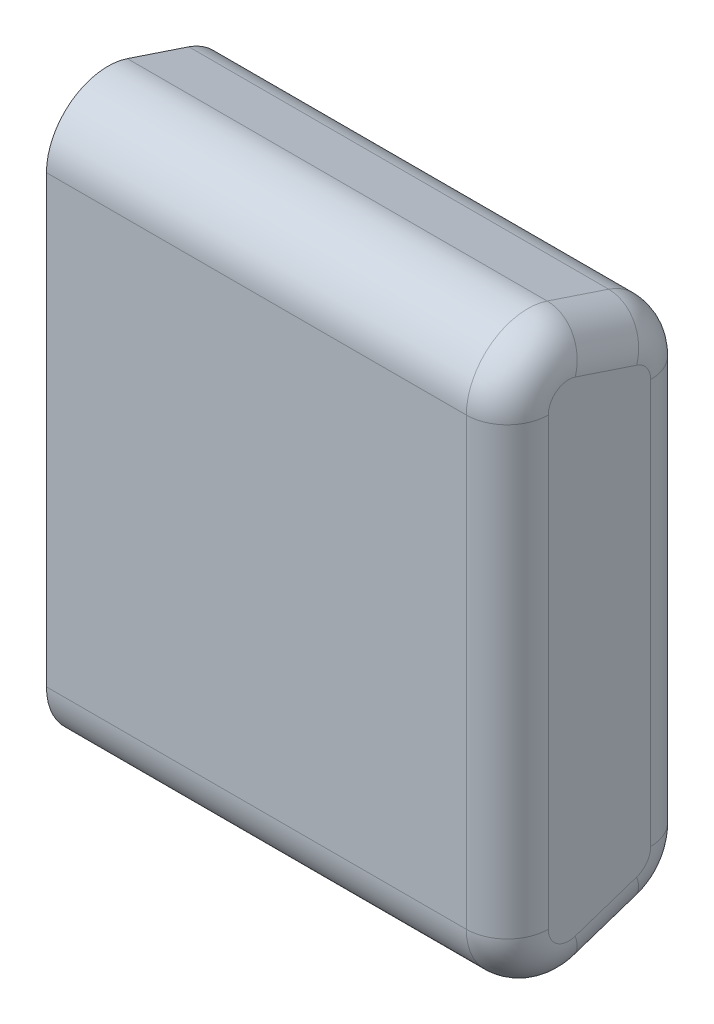
ISO-10303-21;
HEADER;
FILE_DESCRIPTION(('STEP AP214'),'2;1');
FILE_NAME('part.step','',(''),(''),'','','');
FILE_SCHEMA(('AUTOMOTIVE_DESIGN { 1 0 10303 214 1 1 1 1 }'));
ENDSEC;
DATA;
#1=APPLICATION_CONTEXT('core data for automotive mechanical design processes');
#2=APPLICATION_PROTOCOL_DEFINITION('international standard','automotive_design',2000,#1);
#3=PRODUCT_CONTEXT('',#1,'mechanical');
#4=PRODUCT('Part','Part','',(#3));
#5=PRODUCT_RELATED_PRODUCT_CATEGORY('part','',(#4));
#6=PRODUCT_DEFINITION_FORMATION('','',#4);
#7=PRODUCT_DEFINITION_CONTEXT('part definition',#1,'design');
#8=PRODUCT_DEFINITION('design','',#6,#7);
#9=PRODUCT_DEFINITION_SHAPE('','',#8);
#10=(LENGTH_UNIT() NAMED_UNIT(*) SI_UNIT(.MILLI.,.METRE.));
#11=(NAMED_UNIT(*) PLANE_ANGLE_UNIT() SI_UNIT($,.RADIAN.));
#12=(NAMED_UNIT(*) SI_UNIT($,.STERADIAN.) SOLID_ANGLE_UNIT());
#13=UNCERTAINTY_MEASURE_WITH_UNIT(LENGTH_MEASURE(1.E-05),#10,'distance_accuracy_value','');
#14=(GEOMETRIC_REPRESENTATION_CONTEXT(3) GLOBAL_UNCERTAINTY_ASSIGNED_CONTEXT((#13)) GLOBAL_UNIT_ASSIGNED_CONTEXT((#10,
#11,#12)) REPRESENTATION_CONTEXT('',''));
#15=CARTESIAN_POINT('',(0.,0.,0.));
#16=DIRECTION('',(0.,0.,1.));
#17=DIRECTION('',(1.,0.,0.));
#18=AXIS2_PLACEMENT_3D('',#15,#16,#17);
#19=CARTESIAN_POINT('',(-20.7640151736378,2.70446142471295,1.50594305849579));
#20=DIRECTION('',(0.,0.316227766016839,0.948683298050514));
#21=DIRECTION('',(0.,-0.948683298050514,0.316227766016839));
#22=AXIS2_PLACEMENT_3D('',#19,#20,#21);
#23=CYLINDRICAL_SURFACE('',#22,0.500000000000001);
#24=CARTESIAN_POINT('',(-20.7640151736378,2.95446142471295,2.25594305849579));
#25=DIRECTION('',(0.,0.316227766016837,0.948683298050514));
#26=DIRECTION('',(0.,-0.948683298050514,0.316227766016837));
#27=AXIS2_PLACEMENT_3D('',#24,#25,#26);
#28=CIRCLE('',#27,0.500000000000001);
#29=CARTESIAN_POINT('',(-20.2640151736378,2.95446142471295,2.2559430584958));
#30=VERTEX_POINT('',#29);
#31=CARTESIAN_POINT('',(-20.7640151736378,3.4288030737382,2.09782917548737));
#32=VERTEX_POINT('',#31);
#33=EDGE_CURVE('E176',#30,#32,#28,.T.);
#34=ORIENTED_EDGE('',*,*,#33,.F.);
#35=DIRECTION('',(0.,0.316227766016836,0.948683298050515));
#36=VECTOR('',#35,1.);
#37=CARTESIAN_POINT('',(-20.2640151736378,2.70446142471295,1.50594305849579));
#38=LINE('',#37,#36);
#39=CARTESIAN_POINT('',(-20.2640151736378,2.70446142471295,1.50594305849579));
#40=VERTEX_POINT('',#39);
#41=EDGE_CURVE('E253',#40,#30,#38,.T.);
#42=ORIENTED_EDGE('',*,*,#41,.F.);
#43=CARTESIAN_POINT('',(-20.7640151736378,2.70446142471295,1.50594305849579));
#44=DIRECTION('',(0.,-0.316227766016839,-0.948683298050514));
#45=DIRECTION('',(0.,0.948683298050514,-0.316227766016839));
#46=AXIS2_PLACEMENT_3D('',#43,#44,#45);
#47=CIRCLE('',#46,0.500000000000001);
#48=CARTESIAN_POINT('',(-20.7640151736378,3.17880307373821,1.34782917548737));
#49=VERTEX_POINT('',#48);
#50=EDGE_CURVE('E138',#49,#40,#47,.T.);
#51=ORIENTED_EDGE('',*,*,#50,.F.);
#52=DIRECTION('',(0.,-0.316227766016838,-0.948683298050514));
#53=VECTOR('',#52,1.);
#54=CARTESIAN_POINT('',(-20.7640151736378,3.30380307373821,1.72282917548737));
#55=LINE('',#54,#53);
#56=EDGE_CURVE('E156',#32,#49,#55,.T.);
#57=ORIENTED_EDGE('',*,*,#56,.F.);
#58=EDGE_LOOP('',(#34,#42,#51,#57));
#59=FACE_BOUND('',#58,.T.);
#60=ADVANCED_FACE('F16',(#59),#23,.T.);
#61=CARTESIAN_POINT('',(-20.7640151736378,-2.95446142471295,2.25594305849579));
#62=DIRECTION('',(0.,0.316227766016837,-0.948683298050514));
#63=DIRECTION('',(0.,0.948683298050514,0.316227766016837));
#64=AXIS2_PLACEMENT_3D('',#61,#62,#63);
#65=CYLINDRICAL_SURFACE('',#64,0.500000000000002);
#66=CARTESIAN_POINT('',(-20.7640151736378,-2.70446142471295,1.50594305849579));
#67=DIRECTION('',(0.,0.316227766016839,-0.948683298050514));
#68=DIRECTION('',(0.,0.948683298050514,0.316227766016839));
#69=AXIS2_PLACEMENT_3D('',#66,#67,#68);
#70=CIRCLE('',#69,0.500000000000001);
#71=CARTESIAN_POINT('',(-20.2640151736378,-2.70446142471295,1.50594305849579));
#72=VERTEX_POINT('',#71);
#73=CARTESIAN_POINT('',(-20.7640151736378,-3.17880307373821,1.34782917548737));
#74=VERTEX_POINT('',#73);
#75=EDGE_CURVE('E133',#72,#74,#70,.T.);
#76=ORIENTED_EDGE('',*,*,#75,.F.);
#77=DIRECTION('',(0.,0.316227766016837,-0.948683298050514));
#78=VECTOR('',#77,1.);
#79=CARTESIAN_POINT('',(-20.2640151736378,-2.95446142471295,2.25594305849579));
#80=LINE('',#79,#78);
#81=CARTESIAN_POINT('',(-20.2640151736378,-2.95446142471295,2.25594305849579));
#82=VERTEX_POINT('',#81);
#83=EDGE_CURVE('E20',#82,#72,#80,.T.);
#84=ORIENTED_EDGE('',*,*,#83,.F.);
#85=CARTESIAN_POINT('',(-20.7640151736378,-2.95446142471295,2.25594305849579));
#86=DIRECTION('',(0.,-0.316227766016837,0.948683298050514));
#87=DIRECTION('',(0.,-0.948683298050514,-0.316227766016837));
#88=AXIS2_PLACEMENT_3D('',#85,#86,#87);
#89=CIRCLE('',#88,0.500000000000002);
#90=CARTESIAN_POINT('',(-20.7640151736378,-3.4288030737382,2.09782917548737));
#91=VERTEX_POINT('',#90);
#92=EDGE_CURVE('E130',#91,#82,#89,.T.);
#93=ORIENTED_EDGE('',*,*,#92,.F.);
#94=DIRECTION('',(0.,-0.316227766016838,0.948683298050514));
#95=VECTOR('',#94,1.);
#96=CARTESIAN_POINT('',(-20.7640151736378,-3.30380307373821,1.72282917548737));
#97=LINE('',#96,#95);
#98=EDGE_CURVE('E148',#74,#91,#97,.T.);
#99=ORIENTED_EDGE('',*,*,#98,.F.);
#100=EDGE_LOOP('',(#76,#84,#93,#99));
#101=FACE_BOUND('',#100,.T.);
#102=ADVANCED_FACE('F127',(#101),#65,.T.);
#103=CARTESIAN_POINT('',(-20.7640151736378,-2.46729060020032,1.585));
#104=DIRECTION('',(-1.,0.,0.));
#105=DIRECTION('',(0.,0.,1.));
#106=AXIS2_PLACEMENT_3D('',#103,#104,#105);
#107=DEGENERATE_TOROIDAL_SURFACE('',#106,0.249999999999999,0.5,.T.);
#108=CARTESIAN_POINT('',(-20.7640151736378,-2.46729060020032,1.335));
#109=DIRECTION('',(0.,1.,0.));
#110=DIRECTION('',(0.,0.,1.));
#111=AXIS2_PLACEMENT_3D('',#108,#109,#110);
#112=CIRCLE('',#111,0.500000000000001);
#113=CARTESIAN_POINT('',(-20.2640151736378,-2.46729060020032,1.335));
#114=VERTEX_POINT('',#113);
#115=CARTESIAN_POINT('',(-20.7640151736378,-2.46729060020032,0.834999999999999));
#116=VERTEX_POINT('',#115);
#117=EDGE_CURVE('E264',#114,#116,#112,.T.);
#118=ORIENTED_EDGE('',*,*,#117,.F.);
#119=CARTESIAN_POINT('',(-20.2640151736378,-2.46729060020032,1.585));
#120=DIRECTION('',(-1.,0.,0.));
#121=DIRECTION('',(0.,0.,1.));
#122=AXIS2_PLACEMENT_3D('',#119,#120,#121);
#123=CIRCLE('',#122,0.249999999999999);
#124=EDGE_CURVE('E137',#72,#114,#123,.F.);
#125=ORIENTED_EDGE('',*,*,#124,.F.);
#126=ORIENTED_EDGE('',*,*,#75,.T.);
#127=CARTESIAN_POINT('',(-20.7640151736378,-2.46729060020032,1.585));
#128=DIRECTION('',(-1.,0.,0.));
#129=DIRECTION('',(0.,0.,1.));
#130=AXIS2_PLACEMENT_3D('',#127,#128,#129);
#131=CIRCLE('',#130,0.750000000000001);
#132=EDGE_CURVE('E200',#116,#74,#131,.T.);
#133=ORIENTED_EDGE('',*,*,#132,.F.);
#134=EDGE_LOOP('',(#118,#125,#126,#133));
#135=FACE_BOUND('',#134,.T.);
#136=ADVANCED_FACE('F335',(#135),#107,.T.);
#137=CARTESIAN_POINT('',(-20.7640151736378,2.46729060020032,1.585));
#138=DIRECTION('',(-1.,0.,0.));
#139=DIRECTION('',(0.,0.,1.));
#140=AXIS2_PLACEMENT_3D('',#137,#138,#139);
#141=DEGENERATE_TOROIDAL_SURFACE('',#140,0.250000000000001,0.500000000000001,.T.);
#142=ORIENTED_EDGE('',*,*,#50,.T.);
#143=CARTESIAN_POINT('',(-20.2640151736378,2.46729060020032,1.585));
#144=DIRECTION('',(-1.,0.,0.));
#145=DIRECTION('',(0.,0.,1.));
#146=AXIS2_PLACEMENT_3D('',#143,#144,#145);
#147=CIRCLE('',#146,0.250000000000002);
#148=CARTESIAN_POINT('',(-20.2640151736378,2.46729060020032,1.335));
#149=VERTEX_POINT('',#148);
#150=EDGE_CURVE('E255',#149,#40,#147,.F.);
#151=ORIENTED_EDGE('',*,*,#150,.F.);
#152=CARTESIAN_POINT('',(-20.7640151736378,2.46729060020032,1.335));
#153=DIRECTION('',(0.,-1.,0.));
#154=DIRECTION('',(0.,0.,-1.));
#155=AXIS2_PLACEMENT_3D('',#152,#153,#154);
#156=CIRCLE('',#155,0.500000000000001);
#157=CARTESIAN_POINT('',(-20.7640151736378,2.46729060020032,0.834999999999999));
#158=VERTEX_POINT('',#157);
#159=EDGE_CURVE('E208',#158,#149,#156,.T.);
#160=ORIENTED_EDGE('',*,*,#159,.F.);
#161=CARTESIAN_POINT('',(-20.7640151736378,2.46729060020032,1.585));
#162=DIRECTION('',(-1.,0.,0.));
#163=DIRECTION('',(0.,0.,1.));
#164=AXIS2_PLACEMENT_3D('',#161,#162,#163);
#165=CIRCLE('',#164,0.750000000000001);
#166=EDGE_CURVE('E249',#49,#158,#165,.T.);
#167=ORIENTED_EDGE('',*,*,#166,.F.);
#168=EDGE_LOOP('',(#142,#151,#160,#167));
#169=FACE_BOUND('',#168,.T.);
#170=ADVANCED_FACE('F517',(#169),#141,.T.);
#171=CARTESIAN_POINT('',(-20.2640151736378,-2.99493211932498,1.335));
#172=DIRECTION('',(1.,0.,0.));
#173=DIRECTION('',(0.,1.,0.));
#174=AXIS2_PLACEMENT_3D('',#171,#172,#173);
#175=PLANE('',#174);
#176=ORIENTED_EDGE('',*,*,#150,.T.);
#177=ORIENTED_EDGE('',*,*,#41,.T.);
#178=CARTESIAN_POINT('',(-20.2640151736378,2.71729060020032,2.33500000000002));
#179=DIRECTION('',(-1.,0.,0.));
#180=DIRECTION('',(0.,0.,1.));
#181=AXIS2_PLACEMENT_3D('',#178,#179,#180);
#182=CIRCLE('',#181,0.249999999999985);
#183=CARTESIAN_POINT('',(-20.2640151736378,2.71729060020032,2.585));
#184=VERTEX_POINT('',#183);
#185=EDGE_CURVE('E181',#184,#30,#182,.T.);
#186=ORIENTED_EDGE('',*,*,#185,.F.);
#187=DIRECTION('',(0.,1.,0.));
#188=VECTOR('',#187,1.);
#189=CARTESIAN_POINT('',(-20.2640151736378,0.,2.585));
#190=LINE('',#189,#188);
#191=CARTESIAN_POINT('',(-20.2640151736378,-2.71729060020033,2.58499999999999));
#192=VERTEX_POINT('',#191);
#193=EDGE_CURVE('E144',#192,#184,#190,.T.);
#194=ORIENTED_EDGE('',*,*,#193,.F.);
#195=CARTESIAN_POINT('',(-20.2640151736378,-2.71729060020033,2.33499999999999));
#196=DIRECTION('',(-1.,0.,0.));
#197=DIRECTION('',(0.,0.,1.));
#198=AXIS2_PLACEMENT_3D('',#195,#196,#197);
#199=CIRCLE('',#198,0.249999999999987);
#200=EDGE_CURVE('E140',#82,#192,#199,.T.);
#201=ORIENTED_EDGE('',*,*,#200,.F.);
#202=ORIENTED_EDGE('',*,*,#83,.T.);
#203=ORIENTED_EDGE('',*,*,#124,.T.);
#204=DIRECTION('',(0.,-1.,0.));
#205=VECTOR('',#204,1.);
#206=CARTESIAN_POINT('',(-20.2640151736378,0.,1.335));
#207=LINE('',#206,#205);
#208=EDGE_CURVE('E206',#149,#114,#207,.T.);
#209=ORIENTED_EDGE('',*,*,#208,.F.);
#210=EDGE_LOOP('',(#176,#177,#186,#194,#201,#202,#203,#209));
#211=FACE_BOUND('',#210,.T.);
#212=ADVANCED_FACE('F142',(#211),#175,.T.);
#213=CARTESIAN_POINT('',(-20.7640151736378,2.71729060020032,2.33500000000002));
#214=DIRECTION('',(-1.,0.,0.));
#215=DIRECTION('',(0.,0.,1.));
#216=AXIS2_PLACEMENT_3D('',#213,#214,#215);
#217=DEGENERATE_TOROIDAL_SURFACE('',#216,0.249999999999985,0.5,.T.);
#218=ORIENTED_EDGE('',*,*,#33,.T.);
#219=CARTESIAN_POINT('',(-20.7640151736378,2.71729060020032,2.33500000000002));
#220=DIRECTION('',(-1.,0.,0.));
#221=DIRECTION('',(0.,0.,1.));
#222=AXIS2_PLACEMENT_3D('',#219,#220,#221);
#223=CIRCLE('',#222,0.749999999999987);
#224=CARTESIAN_POINT('',(-20.7640151736378,2.71729060020032,3.085));
#225=VERTEX_POINT('',#224);
#226=EDGE_CURVE('E171',#225,#32,#223,.T.);
#227=ORIENTED_EDGE('',*,*,#226,.F.);
#228=CARTESIAN_POINT('',(-20.7640151736378,2.71729060020032,2.585));
#229=DIRECTION('',(0.,-1.,0.));
#230=DIRECTION('',(0.,0.,-1.));
#231=AXIS2_PLACEMENT_3D('',#228,#229,#230);
#232=CIRCLE('',#231,0.5);
#233=EDGE_CURVE('E189',#184,#225,#232,.T.);
#234=ORIENTED_EDGE('',*,*,#233,.F.);
#235=ORIENTED_EDGE('',*,*,#185,.T.);
#236=EDGE_LOOP('',(#218,#227,#234,#235));
#237=FACE_BOUND('',#236,.T.);
#238=ADVANCED_FACE('F526',(#237),#217,.T.);
#239=CARTESIAN_POINT('',(-25.8877613569042,3.17880307373821,1.34782917548737));
#240=DIRECTION('',(0.,0.948683298050514,-0.316227766016838));
#241=DIRECTION('',(0.,0.316227766016838,0.948683298050514));
#242=AXIS2_PLACEMENT_3D('',#239,#240,#241);
#243=PLANE('',#242);
#244=DIRECTION('',(0.,0.316227766016838,0.948683298050514));
#245=VECTOR('',#244,1.);
#246=CARTESIAN_POINT('',(-25.8877613569042,3.30380307373821,1.72282917548737));
#247=LINE('',#246,#245);
#248=CARTESIAN_POINT('',(-25.8877613569042,3.17880307373821,1.34782917548737));
#249=VERTEX_POINT('',#248);
#250=CARTESIAN_POINT('',(-25.8877613569042,3.42880307373821,2.09782917548738));
#251=VERTEX_POINT('',#250);
#252=EDGE_CURVE('E154',#249,#251,#247,.T.);
#253=ORIENTED_EDGE('',*,*,#252,.T.);
#254=DIRECTION('',(-1.,0.,0.));
#255=VECTOR('',#254,1.);
#256=CARTESIAN_POINT('',(-23.325888265271,3.42880307373821,2.09782917548737));
#257=LINE('',#256,#255);
#258=EDGE_CURVE('E167',#32,#251,#257,.T.);
#259=ORIENTED_EDGE('',*,*,#258,.F.);
#260=ORIENTED_EDGE('',*,*,#56,.T.);
#261=DIRECTION('',(1.,0.,0.));
#262=VECTOR('',#261,1.);
#263=CARTESIAN_POINT('',(-23.325888265271,3.17880307373821,1.34782917548737));
#264=LINE('',#263,#262);
#265=EDGE_CURVE('E186',#249,#49,#264,.T.);
#266=ORIENTED_EDGE('',*,*,#265,.F.);
#267=EDGE_LOOP('',(#253,#259,#260,#266));
#268=FACE_BOUND('',#267,.T.);
#269=ADVANCED_FACE('F521',(#268),#243,.T.);
#270=CARTESIAN_POINT('',(-20.7640151736378,-2.71729060020033,2.33499999999999));
#271=DIRECTION('',(-1.,0.,0.));
#272=DIRECTION('',(0.,0.,1.));
#273=AXIS2_PLACEMENT_3D('',#270,#271,#272);
#274=DEGENERATE_TOROIDAL_SURFACE('',#273,0.249999999999987,0.500000000000002,.T.);
#275=ORIENTED_EDGE('',*,*,#92,.T.);
#276=ORIENTED_EDGE('',*,*,#200,.T.);
#277=CARTESIAN_POINT('',(-20.7640151736378,-2.71729060020032,2.585));
#278=DIRECTION('',(0.,1.,0.));
#279=DIRECTION('',(0.,0.,1.));
#280=AXIS2_PLACEMENT_3D('',#277,#278,#279);
#281=CIRCLE('',#280,0.5);
#282=CARTESIAN_POINT('',(-20.7640151736378,-2.71729060020032,3.085));
#283=VERTEX_POINT('',#282);
#284=EDGE_CURVE('E185',#283,#192,#281,.T.);
#285=ORIENTED_EDGE('',*,*,#284,.F.);
#286=CARTESIAN_POINT('',(-20.7640151736378,-2.71729060020032,2.33500000000002));
#287=DIRECTION('',(-1.,0.,0.));
#288=DIRECTION('',(0.,0.,1.));
#289=AXIS2_PLACEMENT_3D('',#286,#287,#288);
#290=CIRCLE('',#289,0.749999999999987);
#291=EDGE_CURVE('E152',#91,#283,#290,.T.);
#292=ORIENTED_EDGE('',*,*,#291,.F.);
#293=EDGE_LOOP('',(#275,#276,#285,#292));
#294=FACE_BOUND('',#293,.T.);
#295=ADVANCED_FACE('F150',(#294),#274,.T.);
#296=CARTESIAN_POINT('',(-25.8877613569042,-3.42880307373821,2.09782917548737));
#297=DIRECTION('',(0.,-0.948683298050514,-0.316227766016838));
#298=DIRECTION('',(0.,0.316227766016838,-0.948683298050514));
#299=AXIS2_PLACEMENT_3D('',#296,#297,#298);
#300=PLANE('',#299);
#301=DIRECTION('',(0.,0.316227766016838,-0.948683298050514));
#302=VECTOR('',#301,1.);
#303=CARTESIAN_POINT('',(-25.8877613569042,-3.30380307373821,1.72282917548737));
#304=LINE('',#303,#302);
#305=CARTESIAN_POINT('',(-25.8877613569042,-3.42880307373821,2.09782917548738));
#306=VERTEX_POINT('',#305);
#307=CARTESIAN_POINT('',(-25.8877613569042,-3.17880307373821,1.34782917548737));
#308=VERTEX_POINT('',#307);
#309=EDGE_CURVE('E160',#306,#308,#304,.T.);
#310=ORIENTED_EDGE('',*,*,#309,.T.);
#311=DIRECTION('',(-1.,0.,0.));
#312=VECTOR('',#311,1.);
#313=CARTESIAN_POINT('',(-23.325888265271,-3.17880307373821,1.34782917548737));
#314=LINE('',#313,#312);
#315=EDGE_CURVE('E196',#74,#308,#314,.T.);
#316=ORIENTED_EDGE('',*,*,#315,.F.);
#317=ORIENTED_EDGE('',*,*,#98,.T.);
#318=DIRECTION('',(1.,0.,0.));
#319=VECTOR('',#318,1.);
#320=CARTESIAN_POINT('',(-23.325888265271,-3.42880307373821,2.09782917548737));
#321=LINE('',#320,#319);
#322=EDGE_CURVE('E245',#306,#91,#321,.T.);
#323=ORIENTED_EDGE('',*,*,#322,.F.);
#324=EDGE_LOOP('',(#310,#316,#317,#323));
#325=FACE_BOUND('',#324,.T.);
#326=ADVANCED_FACE('F538',(#325),#300,.T.);
#327=CARTESIAN_POINT('',(-20.7640151736378,2.46729060020032,1.335));
#328=DIRECTION('',(0.,-1.,0.));
#329=DIRECTION('',(0.,0.,-1.));
#330=AXIS2_PLACEMENT_3D('',#327,#328,#329);
#331=CYLINDRICAL_SURFACE('',#330,0.500000000000001);
#332=ORIENTED_EDGE('',*,*,#159,.T.);
#333=ORIENTED_EDGE('',*,*,#208,.T.);
#334=ORIENTED_EDGE('',*,*,#117,.T.);
#335=DIRECTION('',(0.,-1.,0.));
#336=VECTOR('',#335,1.);
#337=CARTESIAN_POINT('',(-20.7640151736378,0.,0.835));
#338=LINE('',#337,#336);
#339=EDGE_CURVE('E268',#158,#116,#338,.T.);
#340=ORIENTED_EDGE('',*,*,#339,.F.);
#341=EDGE_LOOP('',(#332,#333,#334,#340));
#342=FACE_BOUND('',#341,.T.);
#343=ADVANCED_FACE('F261',(#342),#331,.T.);
#344=CARTESIAN_POINT('',(-20.7640151736378,-2.46729060020032,1.585));
#345=DIRECTION('',(-1.,0.,0.));
#346=DIRECTION('',(0.,0.,1.));
#347=AXIS2_PLACEMENT_3D('',#344,#345,#346);
#348=CYLINDRICAL_SURFACE('',#347,0.750000000000001);
#349=CARTESIAN_POINT('',(-25.8877613569042,-2.46729060020032,1.585));
#350=DIRECTION('',(-1.,0.,0.));
#351=DIRECTION('',(0.,0.,1.));
#352=AXIS2_PLACEMENT_3D('',#349,#350,#351);
#353=CIRCLE('',#352,0.750000000000001);
#354=CARTESIAN_POINT('',(-25.8877613569042,-2.46729060020032,0.835));
#355=VERTEX_POINT('',#354);
#356=EDGE_CURVE('E199',#308,#355,#353,.F.);
#357=ORIENTED_EDGE('',*,*,#356,.T.);
#358=DIRECTION('',(-1.,0.,0.));
#359=VECTOR('',#358,1.);
#360=CARTESIAN_POINT('',(-23.325888265271,-2.46729060020032,0.835));
#361=LINE('',#360,#359);
#362=EDGE_CURVE('E326',#116,#355,#361,.T.);
#363=ORIENTED_EDGE('',*,*,#362,.F.);
#364=ORIENTED_EDGE('',*,*,#132,.T.);
#365=ORIENTED_EDGE('',*,*,#315,.T.);
#366=EDGE_LOOP('',(#357,#363,#364,#365));
#367=FACE_BOUND('',#366,.T.);
#368=ADVANCED_FACE('F331',(#367),#348,.T.);
#369=CARTESIAN_POINT('',(-25.8877613569042,2.46729060020032,1.585));
#370=DIRECTION('',(1.,0.,0.));
#371=DIRECTION('',(0.,0.,-1.));
#372=AXIS2_PLACEMENT_3D('',#369,#370,#371);
#373=CYLINDRICAL_SURFACE('',#372,0.750000000000001);
#374=CARTESIAN_POINT('',(-25.8877613569042,2.46729060020032,1.585));
#375=DIRECTION('',(1.,0.,0.));
#376=DIRECTION('',(0.,0.,-1.));
#377=AXIS2_PLACEMENT_3D('',#374,#375,#376);
#378=CIRCLE('',#377,0.750000000000001);
#379=CARTESIAN_POINT('',(-25.8877613569042,2.46729060020032,0.835));
#380=VERTEX_POINT('',#379);
#381=EDGE_CURVE('E190',#380,#249,#378,.T.);
#382=ORIENTED_EDGE('',*,*,#381,.T.);
#383=ORIENTED_EDGE('',*,*,#265,.T.);
#384=ORIENTED_EDGE('',*,*,#166,.T.);
#385=DIRECTION('',(1.,0.,0.));
#386=VECTOR('',#385,1.);
#387=CARTESIAN_POINT('',(-23.325888265271,2.46729060020032,0.835));
#388=LINE('',#387,#386);
#389=EDGE_CURVE('E308',#380,#158,#388,.T.);
#390=ORIENTED_EDGE('',*,*,#389,.F.);
#391=EDGE_LOOP('',(#382,#383,#384,#390));
#392=FACE_BOUND('',#391,.T.);
#393=ADVANCED_FACE('F516',(#392),#373,.T.);
#394=CARTESIAN_POINT('',(-20.7640151736378,2.71729060020032,2.585));
#395=DIRECTION('',(0.,-1.,0.));
#396=DIRECTION('',(0.,0.,-1.));
#397=AXIS2_PLACEMENT_3D('',#394,#395,#396);
#398=CYLINDRICAL_SURFACE('',#397,0.5);
#399=ORIENTED_EDGE('',*,*,#284,.T.);
#400=ORIENTED_EDGE('',*,*,#193,.T.);
#401=ORIENTED_EDGE('',*,*,#233,.T.);
#402=DIRECTION('',(0.,1.,0.));
#403=VECTOR('',#402,1.);
#404=CARTESIAN_POINT('',(-20.7640151736378,0.,3.085));
#405=LINE('',#404,#403);
#406=EDGE_CURVE('E304',#283,#225,#405,.T.);
#407=ORIENTED_EDGE('',*,*,#406,.F.);
#408=EDGE_LOOP('',(#399,#400,#401,#407));
#409=FACE_BOUND('',#408,.T.);
#410=ADVANCED_FACE('F531',(#409),#398,.T.);
#411=CARTESIAN_POINT('',(-25.8877613569042,2.71729060020032,2.33500000000002));
#412=DIRECTION('',(1.,0.,0.));
#413=DIRECTION('',(0.,0.,-1.));
#414=AXIS2_PLACEMENT_3D('',#411,#412,#413);
#415=CYLINDRICAL_SURFACE('',#414,0.749999999999987);
#416=CARTESIAN_POINT('',(-25.8877613569042,2.71729060020032,2.33500000000002));
#417=DIRECTION('',(1.,0.,0.));
#418=DIRECTION('',(0.,0.,-1.));
#419=AXIS2_PLACEMENT_3D('',#416,#417,#418);
#420=CIRCLE('',#419,0.749999999999987);
#421=CARTESIAN_POINT('',(-25.8877613569042,2.71729060020032,3.085));
#422=VERTEX_POINT('',#421);
#423=EDGE_CURVE('E170',#251,#422,#420,.T.);
#424=ORIENTED_EDGE('',*,*,#423,.T.);
#425=DIRECTION('',(-1.,0.,0.));
#426=VECTOR('',#425,1.);
#427=CARTESIAN_POINT('',(-23.325888265271,2.71729060020032,3.085));
#428=LINE('',#427,#426);
#429=EDGE_CURVE('E307',#225,#422,#428,.T.);
#430=ORIENTED_EDGE('',*,*,#429,.F.);
#431=ORIENTED_EDGE('',*,*,#226,.T.);
#432=ORIENTED_EDGE('',*,*,#258,.T.);
#433=EDGE_LOOP('',(#424,#430,#431,#432));
#434=FACE_BOUND('',#433,.T.);
#435=ADVANCED_FACE('F648',(#434),#415,.T.);
#436=CARTESIAN_POINT('',(-20.7640151736378,-2.71729060020032,2.33500000000002));
#437=DIRECTION('',(-1.,0.,0.));
#438=DIRECTION('',(0.,0.,1.));
#439=AXIS2_PLACEMENT_3D('',#436,#437,#438);
#440=CYLINDRICAL_SURFACE('',#439,0.749999999999987);
#441=CARTESIAN_POINT('',(-25.8877613569042,-2.71729060020032,2.33500000000002));
#442=DIRECTION('',(-1.,0.,0.));
#443=DIRECTION('',(0.,0.,1.));
#444=AXIS2_PLACEMENT_3D('',#441,#442,#443);
#445=CIRCLE('',#444,0.749999999999987);
#446=CARTESIAN_POINT('',(-25.8877613569042,-2.71729060020032,3.085));
#447=VERTEX_POINT('',#446);
#448=EDGE_CURVE('E242',#447,#306,#445,.F.);
#449=ORIENTED_EDGE('',*,*,#448,.T.);
#450=ORIENTED_EDGE('',*,*,#322,.T.);
#451=ORIENTED_EDGE('',*,*,#291,.T.);
#452=DIRECTION('',(1.,0.,0.));
#453=VECTOR('',#452,1.);
#454=CARTESIAN_POINT('',(-23.325888265271,-2.71729060020032,3.085));
#455=LINE('',#454,#453);
#456=EDGE_CURVE('E480',#447,#283,#455,.T.);
#457=ORIENTED_EDGE('',*,*,#456,.F.);
#458=EDGE_LOOP('',(#449,#450,#451,#457));
#459=FACE_BOUND('',#458,.T.);
#460=ADVANCED_FACE('F534',(#459),#440,.T.);
#461=CARTESIAN_POINT('',(-25.8877613569042,-2.84676391942053,1.45850889359327));
#462=DIRECTION('',(0.,0.948683298050513,0.316227766016842));
#463=DIRECTION('',(0.,-0.316227766016842,0.948683298050513));
#464=AXIS2_PLACEMENT_3D('',#461,#462,#463);
#465=PLANE('',#464);
#466=DIRECTION('',(0.,-0.316227766016842,0.948683298050512));
#467=VECTOR('',#466,1.);
#468=CARTESIAN_POINT('',(-25.8877613569042,-2.97176391942053,1.83350889359326));
#469=LINE('',#468,#467);
#470=CARTESIAN_POINT('',(-25.8877613569042,-2.84676391942053,1.45850889359327));
#471=VERTEX_POINT('',#470);
#472=CARTESIAN_POINT('',(-25.8877613569042,-3.09676391942053,2.20850889359326));
#473=VERTEX_POINT('',#472);
#474=EDGE_CURVE('E288',#471,#473,#469,.T.);
#475=ORIENTED_EDGE('',*,*,#474,.T.);
#476=DIRECTION('',(-1.,0.,0.));
#477=VECTOR('',#476,1.);
#478=CARTESIAN_POINT('',(-23.325888265271,-3.09676391942053,2.20850889359326));
#479=LINE('',#478,#477);
#480=CARTESIAN_POINT('',(-20.7640151736378,-3.09676391942053,2.20850889359326));
#481=VERTEX_POINT('',#480);
#482=EDGE_CURVE('E455',#481,#473,#479,.T.);
#483=ORIENTED_EDGE('',*,*,#482,.F.);
#484=DIRECTION('',(0.,0.316227766016842,-0.948683298050512));
#485=VECTOR('',#484,1.);
#486=CARTESIAN_POINT('',(-20.7640151736378,-2.97176391942053,1.83350889359326));
#487=LINE('',#486,#485);
#488=CARTESIAN_POINT('',(-20.7640151736378,-2.84676391942053,1.45850889359327));
#489=VERTEX_POINT('',#488);
#490=EDGE_CURVE('E283',#481,#489,#487,.T.);
#491=ORIENTED_EDGE('',*,*,#490,.T.);
#492=DIRECTION('',(1.,0.,0.));
#493=VECTOR('',#492,1.);
#494=CARTESIAN_POINT('',(-23.325888265271,-2.84676391942053,1.45850889359327));
#495=LINE('',#494,#493);
#496=EDGE_CURVE('E459',#471,#489,#495,.T.);
#497=ORIENTED_EDGE('',*,*,#496,.F.);
#498=EDGE_LOOP('',(#475,#483,#491,#497));
#499=FACE_BOUND('',#498,.T.);
#500=ADVANCED_FACE('F591',(#499),#465,.T.);
#501=CARTESIAN_POINT('',(-20.7640151736378,-2.46729060020032,0.835));
#502=DIRECTION('',(0.,0.,-1.));
#503=DIRECTION('',(-1.,0.,0.));
#504=AXIS2_PLACEMENT_3D('',#501,#502,#503);
#505=PLANE('',#504);
#506=DIRECTION('',(0.,-1.,0.));
#507=VECTOR('',#506,1.);
#508=CARTESIAN_POINT('',(-25.8877613569042,0.,0.835));
#509=LINE('',#508,#507);
#510=EDGE_CURVE('E452',#380,#355,#509,.T.);
#511=ORIENTED_EDGE('',*,*,#510,.F.);
#512=ORIENTED_EDGE('',*,*,#389,.T.);
#513=ORIENTED_EDGE('',*,*,#339,.T.);
#514=ORIENTED_EDGE('',*,*,#362,.T.);
#515=EDGE_LOOP('',(#511,#512,#513,#514));
#516=FACE_BOUND('',#515,.T.);
#517=ADVANCED_FACE('F508',(#516),#505,.T.);
#518=CARTESIAN_POINT('',(-25.8877613569042,-2.71729060020032,3.085));
#519=DIRECTION('',(0.,0.,1.));
#520=DIRECTION('',(1.,0.,0.));
#521=AXIS2_PLACEMENT_3D('',#518,#519,#520);
#522=PLANE('',#521);
#523=DIRECTION('',(0.,1.,0.));
#524=VECTOR('',#523,1.);
#525=CARTESIAN_POINT('',(-25.8877613569042,0.,3.085));
#526=LINE('',#525,#524);
#527=EDGE_CURVE('E241',#447,#422,#526,.T.);
#528=ORIENTED_EDGE('',*,*,#527,.F.);
#529=ORIENTED_EDGE('',*,*,#456,.T.);
#530=ORIENTED_EDGE('',*,*,#406,.T.);
#531=ORIENTED_EDGE('',*,*,#429,.T.);
#532=EDGE_LOOP('',(#528,#529,#530,#531));
#533=FACE_BOUND('',#532,.T.);
#534=ADVANCED_FACE('F536',(#533),#522,.T.);
#535=CARTESIAN_POINT('',(-25.8877613569042,3.09676391942053,2.20850889359326));
#536=DIRECTION('',(0.,-0.948683298050513,0.316227766016842));
#537=DIRECTION('',(0.,-0.316227766016842,-0.948683298050513));
#538=AXIS2_PLACEMENT_3D('',#535,#536,#537);
#539=PLANE('',#538);
#540=DIRECTION('',(0.,0.316227766016842,0.948683298050512));
#541=VECTOR('',#540,1.);
#542=CARTESIAN_POINT('',(-25.8877613569042,2.84676391942053,1.45850889359327));
#543=LINE('',#542,#541);
#544=CARTESIAN_POINT('',(-25.8877613569042,2.84676391942053,1.45850889359327));
#545=VERTEX_POINT('',#544);
#546=CARTESIAN_POINT('',(-25.8877613569042,3.09676391942053,2.20850889359326));
#547=VERTEX_POINT('',#546);
#548=EDGE_CURVE('E236',#545,#547,#543,.T.);
#549=ORIENTED_EDGE('',*,*,#548,.F.);
#550=DIRECTION('',(-1.,0.,0.));
#551=VECTOR('',#550,1.);
#552=CARTESIAN_POINT('',(-23.325888265271,2.84676391942053,1.45850889359327));
#553=LINE('',#552,#551);
#554=CARTESIAN_POINT('',(-20.7640151736378,2.84676391942053,1.45850889359327));
#555=VERTEX_POINT('',#554);
#556=EDGE_CURVE('E463',#555,#545,#553,.T.);
#557=ORIENTED_EDGE('',*,*,#556,.F.);
#558=DIRECTION('',(0.,0.316227766016842,0.948683298050512));
#559=VECTOR('',#558,1.);
#560=CARTESIAN_POINT('',(-20.7640151736378,2.97176391942053,1.83350889359326));
#561=LINE('',#560,#559);
#562=CARTESIAN_POINT('',(-20.7640151736378,3.09676391942053,2.20850889359326));
#563=VERTEX_POINT('',#562);
#564=EDGE_CURVE('E471',#555,#563,#561,.T.);
#565=ORIENTED_EDGE('',*,*,#564,.T.);
#566=DIRECTION('',(1.,0.,0.));
#567=VECTOR('',#566,1.);
#568=CARTESIAN_POINT('',(-23.325888265271,3.09676391942053,2.20850889359326));
#569=LINE('',#568,#567);
#570=EDGE_CURVE('E229',#547,#563,#569,.T.);
#571=ORIENTED_EDGE('',*,*,#570,.F.);
#572=EDGE_LOOP('',(#549,#557,#565,#571));
#573=FACE_BOUND('',#572,.T.);
#574=ADVANCED_FACE('F564',(#573),#539,.T.);
#575=CARTESIAN_POINT('',(-20.7640151736378,2.46729060020032,1.58500000000001));
#576=DIRECTION('',(-1.,0.,0.));
#577=DIRECTION('',(0.,0.,1.));
#578=AXIS2_PLACEMENT_3D('',#575,#576,#577);
#579=CYLINDRICAL_SURFACE('',#578,0.400000000000007);
#580=CARTESIAN_POINT('',(-25.8877613569042,2.46729060020032,1.58500000000001));
#581=DIRECTION('',(-1.,0.,0.));
#582=DIRECTION('',(0.,0.,1.));
#583=AXIS2_PLACEMENT_3D('',#580,#581,#582);
#584=CIRCLE('',#583,0.400000000000007);
#585=CARTESIAN_POINT('',(-25.8877613569042,2.46729060020032,1.185));
#586=VERTEX_POINT('',#585);
#587=EDGE_CURVE('E238',#586,#545,#584,.F.);
#588=ORIENTED_EDGE('',*,*,#587,.F.);
#589=DIRECTION('',(-1.,0.,0.));
#590=VECTOR('',#589,1.);
#591=CARTESIAN_POINT('',(-23.325888265271,2.46729060020032,1.185));
#592=LINE('',#591,#590);
#593=CARTESIAN_POINT('',(-20.7640151736378,2.46729060020032,1.185));
#594=VERTEX_POINT('',#593);
#595=EDGE_CURVE('E439',#594,#586,#592,.T.);
#596=ORIENTED_EDGE('',*,*,#595,.F.);
#597=CARTESIAN_POINT('',(-20.7640151736378,2.46729060020032,1.58500000000001));
#598=DIRECTION('',(1.,0.,0.));
#599=DIRECTION('',(0.,0.,-1.));
#600=AXIS2_PLACEMENT_3D('',#597,#598,#599);
#601=CIRCLE('',#600,0.400000000000007);
#602=EDGE_CURVE('E468',#594,#555,#601,.T.);
#603=ORIENTED_EDGE('',*,*,#602,.T.);
#604=ORIENTED_EDGE('',*,*,#556,.T.);
#605=EDGE_LOOP('',(#588,#596,#603,#604));
#606=FACE_BOUND('',#605,.T.);
#607=ADVANCED_FACE('F574',(#606),#579,.F.);
#608=CARTESIAN_POINT('',(-25.8877613569042,-2.46729060020032,1.58500000000001));
#609=DIRECTION('',(1.,0.,0.));
#610=DIRECTION('',(0.,0.,-1.));
#611=AXIS2_PLACEMENT_3D('',#608,#609,#610);
#612=CYLINDRICAL_SURFACE('',#611,0.400000000000007);
#613=CARTESIAN_POINT('',(-25.8877613569042,-2.46729060020032,1.58500000000001));
#614=DIRECTION('',(1.,0.,0.));
#615=DIRECTION('',(0.,0.,-1.));
#616=AXIS2_PLACEMENT_3D('',#613,#614,#615);
#617=CIRCLE('',#616,0.400000000000007);
#618=CARTESIAN_POINT('',(-25.8877613569042,-2.46729060020032,1.185));
#619=VERTEX_POINT('',#618);
#620=EDGE_CURVE('E231',#471,#619,#617,.T.);
#621=ORIENTED_EDGE('',*,*,#620,.F.);
#622=ORIENTED_EDGE('',*,*,#496,.T.);
#623=CARTESIAN_POINT('',(-20.7640151736378,-2.46729060020032,1.58500000000001));
#624=DIRECTION('',(1.,0.,0.));
#625=DIRECTION('',(0.,0.,-1.));
#626=AXIS2_PLACEMENT_3D('',#623,#624,#625);
#627=CIRCLE('',#626,0.400000000000007);
#628=CARTESIAN_POINT('',(-20.7640151736378,-2.46729060020032,1.185));
#629=VERTEX_POINT('',#628);
#630=EDGE_CURVE('E367',#489,#629,#627,.T.);
#631=ORIENTED_EDGE('',*,*,#630,.T.);
#632=DIRECTION('',(1.,0.,0.));
#633=VECTOR('',#632,1.);
#634=CARTESIAN_POINT('',(-23.325888265271,-2.46729060020032,1.185));
#635=LINE('',#634,#633);
#636=EDGE_CURVE('E423',#619,#629,#635,.T.);
#637=ORIENTED_EDGE('',*,*,#636,.F.);
#638=EDGE_LOOP('',(#621,#622,#631,#637));
#639=FACE_BOUND('',#638,.T.);
#640=ADVANCED_FACE('F632',(#639),#612,.F.);
#641=CARTESIAN_POINT('',(-25.8877613569042,-2.71729060020032,2.33499999999999));
#642=DIRECTION('',(1.,0.,0.));
#643=DIRECTION('',(0.,0.,-1.));
#644=AXIS2_PLACEMENT_3D('',#641,#642,#643);
#645=CYLINDRICAL_SURFACE('',#644,0.400000000000008);
#646=CARTESIAN_POINT('',(-25.8877613569042,-2.71729060020032,2.33499999999999));
#647=DIRECTION('',(1.,0.,0.));
#648=DIRECTION('',(0.,0.,-1.));
#649=AXIS2_PLACEMENT_3D('',#646,#647,#648);
#650=CIRCLE('',#649,0.400000000000008);
#651=CARTESIAN_POINT('',(-25.8877613569042,-2.71729060020032,2.735));
#652=VERTEX_POINT('',#651);
#653=EDGE_CURVE('E233',#652,#473,#650,.T.);
#654=ORIENTED_EDGE('',*,*,#653,.F.);
#655=DIRECTION('',(-1.,0.,0.));
#656=VECTOR('',#655,1.);
#657=CARTESIAN_POINT('',(-23.325888265271,-2.71729060020032,2.735));
#658=LINE('',#657,#656);
#659=CARTESIAN_POINT('',(-20.7640151736378,-2.71729060020032,2.735));
#660=VERTEX_POINT('',#659);
#661=EDGE_CURVE('E419',#660,#652,#658,.T.);
#662=ORIENTED_EDGE('',*,*,#661,.F.);
#663=CARTESIAN_POINT('',(-20.7640151736378,-2.71729060020032,2.33499999999999));
#664=DIRECTION('',(1.,0.,0.));
#665=DIRECTION('',(0.,0.,-1.));
#666=AXIS2_PLACEMENT_3D('',#663,#664,#665);
#667=CIRCLE('',#666,0.400000000000008);
#668=EDGE_CURVE('E456',#660,#481,#667,.T.);
#669=ORIENTED_EDGE('',*,*,#668,.T.);
#670=ORIENTED_EDGE('',*,*,#482,.T.);
#671=EDGE_LOOP('',(#654,#662,#669,#670));
#672=FACE_BOUND('',#671,.T.);
#673=ADVANCED_FACE('F593',(#672),#645,.F.);
#674=CARTESIAN_POINT('',(-25.8877613569042,3.5502151575743,0.835));
#675=DIRECTION('',(-1.,0.,0.));
#676=DIRECTION('',(0.,-1.,0.));
#677=AXIS2_PLACEMENT_3D('',#674,#675,#676);
#678=PLANE('',#677);
#679=ORIENTED_EDGE('',*,*,#620,.T.);
#680=DIRECTION('',(0.,-1.,0.));
#681=VECTOR('',#680,1.);
#682=CARTESIAN_POINT('',(-25.8877613569042,0.,1.185));
#683=LINE('',#682,#681);
#684=EDGE_CURVE('E436',#586,#619,#683,.T.);
#685=ORIENTED_EDGE('',*,*,#684,.F.);
#686=ORIENTED_EDGE('',*,*,#587,.T.);
#687=ORIENTED_EDGE('',*,*,#548,.T.);
#688=CARTESIAN_POINT('',(-25.8877613569042,2.71729060020032,2.33499999999999));
#689=DIRECTION('',(-1.,0.,0.));
#690=DIRECTION('',(0.,0.,1.));
#691=AXIS2_PLACEMENT_3D('',#688,#689,#690);
#692=CIRCLE('',#691,0.400000000000008);
#693=CARTESIAN_POINT('',(-25.8877613569042,2.71729060020032,2.735));
#694=VERTEX_POINT('',#693);
#695=EDGE_CURVE('E226',#694,#547,#692,.T.);
#696=ORIENTED_EDGE('',*,*,#695,.F.);
#697=DIRECTION('',(0.,1.,0.));
#698=VECTOR('',#697,1.);
#699=CARTESIAN_POINT('',(-25.8877613569042,0.,2.735));
#700=LINE('',#699,#698);
#701=EDGE_CURVE('E422',#652,#694,#700,.T.);
#702=ORIENTED_EDGE('',*,*,#701,.F.);
#703=ORIENTED_EDGE('',*,*,#653,.T.);
#704=ORIENTED_EDGE('',*,*,#474,.F.);
#705=EDGE_LOOP('',(#679,#685,#686,#687,#696,#702,#703,#704));
#706=FACE_BOUND('',#705,.T.);
#707=ORIENTED_EDGE('',*,*,#423,.F.);
#708=ORIENTED_EDGE('',*,*,#252,.F.);
#709=ORIENTED_EDGE('',*,*,#381,.F.);
#710=ORIENTED_EDGE('',*,*,#510,.T.);
#711=ORIENTED_EDGE('',*,*,#356,.F.);
#712=ORIENTED_EDGE('',*,*,#309,.F.);
#713=ORIENTED_EDGE('',*,*,#448,.F.);
#714=ORIENTED_EDGE('',*,*,#527,.T.);
#715=EDGE_LOOP('',(#707,#708,#709,#710,#711,#712,#713,#714));
#716=FACE_BOUND('',#715,.T.);
#717=ADVANCED_FACE('F512',(#706,#716),#678,.T.);
#718=CARTESIAN_POINT('',(-20.7640151736378,2.71729060020032,2.33499999999999));
#719=DIRECTION('',(-1.,0.,0.));
#720=DIRECTION('',(0.,0.,1.));
#721=AXIS2_PLACEMENT_3D('',#718,#719,#720);
#722=CYLINDRICAL_SURFACE('',#721,0.400000000000008);
#723=ORIENTED_EDGE('',*,*,#695,.T.);
#724=ORIENTED_EDGE('',*,*,#570,.T.);
#725=CARTESIAN_POINT('',(-20.7640151736378,2.71729060020032,2.33499999999999));
#726=DIRECTION('',(1.,0.,0.));
#727=DIRECTION('',(0.,0.,-1.));
#728=AXIS2_PLACEMENT_3D('',#725,#726,#727);
#729=CIRCLE('',#728,0.400000000000008);
#730=CARTESIAN_POINT('',(-20.7640151736378,2.71729060020032,2.735));
#731=VERTEX_POINT('',#730);
#732=EDGE_CURVE('E230',#563,#731,#729,.T.);
#733=ORIENTED_EDGE('',*,*,#732,.T.);
#734=DIRECTION('',(1.,0.,0.));
#735=VECTOR('',#734,1.);
#736=CARTESIAN_POINT('',(-23.325888265271,2.71729060020032,2.735));
#737=LINE('',#736,#735);
#738=EDGE_CURVE('E409',#694,#731,#737,.T.);
#739=ORIENTED_EDGE('',*,*,#738,.F.);
#740=EDGE_LOOP('',(#723,#724,#733,#739));
#741=FACE_BOUND('',#740,.T.);
#742=ADVANCED_FACE('F566',(#741),#722,.F.);
#743=CARTESIAN_POINT('',(-25.8877613569042,-2.46729060020032,1.185));
#744=DIRECTION('',(0.,0.,1.));
#745=DIRECTION('',(1.,0.,0.));
#746=AXIS2_PLACEMENT_3D('',#743,#744,#745);
#747=PLANE('',#746);
#748=ORIENTED_EDGE('',*,*,#684,.T.);
#749=ORIENTED_EDGE('',*,*,#636,.T.);
#750=DIRECTION('',(0.,-1.,0.));
#751=VECTOR('',#750,1.);
#752=CARTESIAN_POINT('',(-20.7640151736378,0.,1.185));
#753=LINE('',#752,#751);
#754=EDGE_CURVE('E404',#594,#629,#753,.T.);
#755=ORIENTED_EDGE('',*,*,#754,.F.);
#756=ORIENTED_EDGE('',*,*,#595,.T.);
#757=EDGE_LOOP('',(#748,#749,#755,#756));
#758=FACE_BOUND('',#757,.T.);
#759=ADVANCED_FACE('F622',(#758),#747,.T.);
#760=CARTESIAN_POINT('',(-20.7640151736378,-2.71729060020032,2.735));
#761=DIRECTION('',(0.,0.,-1.));
#762=DIRECTION('',(-1.,0.,0.));
#763=AXIS2_PLACEMENT_3D('',#760,#761,#762);
#764=PLANE('',#763);
#765=ORIENTED_EDGE('',*,*,#701,.T.);
#766=ORIENTED_EDGE('',*,*,#738,.T.);
#767=DIRECTION('',(0.,1.,0.));
#768=VECTOR('',#767,1.);
#769=CARTESIAN_POINT('',(-20.7640151736378,0.,2.735));
#770=LINE('',#769,#768);
#771=EDGE_CURVE('E391',#660,#731,#770,.T.);
#772=ORIENTED_EDGE('',*,*,#771,.F.);
#773=ORIENTED_EDGE('',*,*,#661,.T.);
#774=EDGE_LOOP('',(#765,#766,#772,#773));
#775=FACE_BOUND('',#774,.T.);
#776=ADVANCED_FACE('F596',(#775),#764,.T.);
#777=CARTESIAN_POINT('',(-20.7640151736378,2.46729060020032,1.58499999999999));
#778=DIRECTION('',(-1.,0.,0.));
#779=DIRECTION('',(0.,0.,1.));
#780=AXIS2_PLACEMENT_3D('',#777,#778,#779);
#781=TOROIDAL_SURFACE('',#780,0.249999999999999,0.149999999999997);
#782=CARTESIAN_POINT('',(-20.7640151736378,2.70446142471295,1.50594305849579));
#783=DIRECTION('',(0.,-0.316227766016859,-0.948683298050507));
#784=DIRECTION('',(0.,0.948683298050507,-0.316227766016859));
#785=AXIS2_PLACEMENT_3D('',#782,#783,#784);
#786=CIRCLE('',#785,0.149999999999999);
#787=CARTESIAN_POINT('',(-20.6140151736378,2.70446142471295,1.50594305849579));
#788=VERTEX_POINT('',#787);
#789=EDGE_CURVE('E225',#555,#788,#786,.T.);
#790=ORIENTED_EDGE('',*,*,#789,.F.);
#791=ORIENTED_EDGE('',*,*,#602,.F.);
#792=CARTESIAN_POINT('',(-20.7640151736378,2.46729060020032,1.335));
#793=DIRECTION('',(0.,1.,0.));
#794=DIRECTION('',(0.,0.,1.));
#795=AXIS2_PLACEMENT_3D('',#792,#793,#794);
#796=CIRCLE('',#795,0.149999999999997);
#797=CARTESIAN_POINT('',(-20.6140151736378,2.46729060020032,1.335));
#798=VERTEX_POINT('',#797);
#799=EDGE_CURVE('E407',#798,#594,#796,.T.);
#800=ORIENTED_EDGE('',*,*,#799,.F.);
#801=CARTESIAN_POINT('',(-20.6140151736378,2.46729060020032,1.58499999999999));
#802=DIRECTION('',(-1.,0.,0.));
#803=DIRECTION('',(0.,0.,1.));
#804=AXIS2_PLACEMENT_3D('',#801,#802,#803);
#805=CIRCLE('',#804,0.249999999999992);
#806=EDGE_CURVE('E221',#788,#798,#805,.T.);
#807=ORIENTED_EDGE('',*,*,#806,.F.);
#808=EDGE_LOOP('',(#790,#791,#800,#807));
#809=FACE_BOUND('',#808,.T.);
#810=ADVANCED_FACE('F580',(#809),#781,.F.);
#811=CARTESIAN_POINT('',(-20.7640151736378,-2.46729060020032,1.335));
#812=DIRECTION('',(0.,1.,0.));
#813=DIRECTION('',(0.,0.,1.));
#814=AXIS2_PLACEMENT_3D('',#811,#812,#813);
#815=CYLINDRICAL_SURFACE('',#814,0.149999999999997);
#816=ORIENTED_EDGE('',*,*,#799,.T.);
#817=ORIENTED_EDGE('',*,*,#754,.T.);
#818=CARTESIAN_POINT('',(-20.7640151736378,-2.46729060020032,1.335));
#819=DIRECTION('',(0.,1.,0.));
#820=DIRECTION('',(0.,0.,1.));
#821=AXIS2_PLACEMENT_3D('',#818,#819,#820);
#822=CIRCLE('',#821,0.149999999999997);
#823=CARTESIAN_POINT('',(-20.6140151736378,-2.46729060020032,1.335));
#824=VERTEX_POINT('',#823);
#825=EDGE_CURVE('E370',#824,#629,#822,.T.);
#826=ORIENTED_EDGE('',*,*,#825,.F.);
#827=DIRECTION('',(0.,-1.,0.));
#828=VECTOR('',#827,1.);
#829=CARTESIAN_POINT('',(-20.6140151736378,0.,1.335));
#830=LINE('',#829,#828);
#831=EDGE_CURVE('E220',#798,#824,#830,.T.);
#832=ORIENTED_EDGE('',*,*,#831,.F.);
#833=EDGE_LOOP('',(#816,#817,#826,#832));
#834=FACE_BOUND('',#833,.T.);
#835=ADVANCED_FACE('F615',(#834),#815,.F.);
#836=CARTESIAN_POINT('',(-20.7640151736378,-2.46729060020032,1.58499999999999));
#837=DIRECTION('',(-1.,0.,0.));
#838=DIRECTION('',(0.,0.,1.));
#839=AXIS2_PLACEMENT_3D('',#836,#837,#838);
#840=TOROIDAL_SURFACE('',#839,0.249999999999991,0.149999999999997);
#841=ORIENTED_EDGE('',*,*,#825,.T.);
#842=ORIENTED_EDGE('',*,*,#630,.F.);
#843=CARTESIAN_POINT('',(-20.7640151736378,-2.70446142471295,1.50594305849579));
#844=DIRECTION('',(0.,0.316227766016859,-0.948683298050507));
#845=DIRECTION('',(0.,0.948683298050507,0.316227766016859));
#846=AXIS2_PLACEMENT_3D('',#843,#844,#845);
#847=CIRCLE('',#846,0.149999999999999);
#848=CARTESIAN_POINT('',(-20.6140151736378,-2.70446142471295,1.50594305849579));
#849=VERTEX_POINT('',#848);
#850=EDGE_CURVE('E361',#849,#489,#847,.T.);
#851=ORIENTED_EDGE('',*,*,#850,.F.);
#852=CARTESIAN_POINT('',(-20.6140151736378,-2.46729060020032,1.58499999999999));
#853=DIRECTION('',(-1.,0.,0.));
#854=DIRECTION('',(0.,0.,1.));
#855=AXIS2_PLACEMENT_3D('',#852,#853,#854);
#856=CIRCLE('',#855,0.25);
#857=EDGE_CURVE('E217',#824,#849,#856,.T.);
#858=ORIENTED_EDGE('',*,*,#857,.F.);
#859=EDGE_LOOP('',(#841,#842,#851,#858));
#860=FACE_BOUND('',#859,.T.);
#861=ADVANCED_FACE('F364',(#860),#840,.F.);
#862=CARTESIAN_POINT('',(-20.7640151736378,-2.70446142471295,1.50594305849579));
#863=DIRECTION('',(0.,-0.316227766016859,0.948683298050507));
#864=DIRECTION('',(0.,-0.948683298050507,-0.316227766016859));
#865=AXIS2_PLACEMENT_3D('',#862,#863,#864);
#866=CYLINDRICAL_SURFACE('',#865,0.149999999999999);
#867=ORIENTED_EDGE('',*,*,#850,.T.);
#868=ORIENTED_EDGE('',*,*,#490,.F.);
#869=CARTESIAN_POINT('',(-20.7640151736378,-2.95446142471295,2.25594305849579));
#870=DIRECTION('',(0.,0.316227766016863,-0.948683298050505));
#871=DIRECTION('',(0.,0.948683298050506,0.316227766016863));
#872=AXIS2_PLACEMENT_3D('',#869,#870,#871);
#873=CIRCLE('',#872,0.149999999999999);
#874=CARTESIAN_POINT('',(-20.6140151736378,-2.95446142471295,2.25594305849579));
#875=VERTEX_POINT('',#874);
#876=EDGE_CURVE('E369',#875,#481,#873,.T.);
#877=ORIENTED_EDGE('',*,*,#876,.F.);
#878=DIRECTION('',(0.,-0.316227766016836,0.948683298050515));
#879=VECTOR('',#878,1.);
#880=CARTESIAN_POINT('',(-20.6140151736378,-2.70446142471295,1.50594305849579));
#881=LINE('',#880,#879);
#882=EDGE_CURVE('E214',#849,#875,#881,.T.);
#883=ORIENTED_EDGE('',*,*,#882,.F.);
#884=EDGE_LOOP('',(#867,#868,#877,#883));
#885=FACE_BOUND('',#884,.T.);
#886=ADVANCED_FACE('F372',(#885),#866,.F.);
#887=CARTESIAN_POINT('',(-20.7640151736378,-2.71729060020032,2.335));
#888=DIRECTION('',(-1.,0.,0.));
#889=DIRECTION('',(0.,0.,1.));
#890=AXIS2_PLACEMENT_3D('',#887,#888,#889);
#891=TOROIDAL_SURFACE('',#890,0.250000000000003,0.149999999999999);
#892=ORIENTED_EDGE('',*,*,#876,.T.);
#893=ORIENTED_EDGE('',*,*,#668,.F.);
#894=CARTESIAN_POINT('',(-20.7640151736378,-2.71729060020032,2.585));
#895=DIRECTION('',(0.,-1.,0.));
#896=DIRECTION('',(0.,0.,-1.));
#897=AXIS2_PLACEMENT_3D('',#894,#895,#896);
#898=CIRCLE('',#897,0.149999999999996);
#899=CARTESIAN_POINT('',(-20.6140151736378,-2.71729060020032,2.585));
#900=VERTEX_POINT('',#899);
#901=EDGE_CURVE('E388',#900,#660,#898,.T.);
#902=ORIENTED_EDGE('',*,*,#901,.F.);
#903=CARTESIAN_POINT('',(-20.6140151736378,-2.71729060020032,2.335));
#904=DIRECTION('',(-1.,0.,0.));
#905=DIRECTION('',(0.,0.,1.));
#906=AXIS2_PLACEMENT_3D('',#903,#904,#905);
#907=CIRCLE('',#906,0.25);
#908=EDGE_CURVE('E210',#875,#900,#907,.T.);
#909=ORIENTED_EDGE('',*,*,#908,.F.);
#910=EDGE_LOOP('',(#892,#893,#902,#909));
#911=FACE_BOUND('',#910,.T.);
#912=ADVANCED_FACE('F589',(#911),#891,.F.);
#913=CARTESIAN_POINT('',(-20.7640151736378,-2.71729060020032,2.585));
#914=DIRECTION('',(0.,1.,0.));
#915=DIRECTION('',(0.,0.,1.));
#916=AXIS2_PLACEMENT_3D('',#913,#914,#915);
#917=CYLINDRICAL_SURFACE('',#916,0.149999999999996);
#918=ORIENTED_EDGE('',*,*,#901,.T.);
#919=ORIENTED_EDGE('',*,*,#771,.T.);
#920=CARTESIAN_POINT('',(-20.7640151736378,2.71729060020032,2.585));
#921=DIRECTION('',(0.,1.,0.));
#922=DIRECTION('',(0.,0.,1.));
#923=AXIS2_PLACEMENT_3D('',#920,#921,#922);
#924=CIRCLE('',#923,0.149999999999996);
#925=CARTESIAN_POINT('',(-20.6140151736378,2.71729060020032,2.58500000000072));
#926=VERTEX_POINT('',#925);
#927=EDGE_CURVE('E392',#731,#926,#924,.T.);
#928=ORIENTED_EDGE('',*,*,#927,.T.);
#929=DIRECTION('',(0.,1.,0.));
#930=VECTOR('',#929,1.);
#931=CARTESIAN_POINT('',(-20.6140151736378,0.,2.585));
#932=LINE('',#931,#930);
#933=EDGE_CURVE('E213',#900,#926,#932,.T.);
#934=ORIENTED_EDGE('',*,*,#933,.F.);
#935=EDGE_LOOP('',(#918,#919,#928,#934));
#936=FACE_BOUND('',#935,.T.);
#937=ADVANCED_FACE('F599',(#936),#917,.F.);
#938=CARTESIAN_POINT('',(-20.7640151736378,2.95446142471295,2.25594305849579));
#939=DIRECTION('',(0.,-0.316227766016863,-0.948683298050506));
#940=DIRECTION('',(0.,0.948683298050506,-0.316227766016863));
#941=AXIS2_PLACEMENT_3D('',#938,#939,#940);
#942=CYLINDRICAL_SURFACE('',#941,0.149999999999999);
#943=CARTESIAN_POINT('',(-20.7640151736378,2.95446142471295,2.25594305849579));
#944=DIRECTION('',(0.,-0.316227766016863,-0.948683298050505));
#945=DIRECTION('',(0.,0.948683298050506,-0.316227766016863));
#946=AXIS2_PLACEMENT_3D('',#943,#944,#945);
#947=CIRCLE('',#946,0.149999999999999);
#948=CARTESIAN_POINT('',(-20.6140151736378,2.95446142471364,2.25594305849556));
#949=VERTEX_POINT('',#948);
#950=EDGE_CURVE('E26',#563,#949,#947,.T.);
#951=ORIENTED_EDGE('',*,*,#950,.F.);
#952=ORIENTED_EDGE('',*,*,#564,.F.);
#953=ORIENTED_EDGE('',*,*,#789,.T.);
#954=DIRECTION('',(0.,-0.316227766016837,-0.948683298050514));
#955=VECTOR('',#954,1.);
#956=CARTESIAN_POINT('',(-20.6140151736378,2.95446142471295,2.25594305849579));
#957=LINE('',#956,#955);
#958=EDGE_CURVE('E35',#949,#788,#957,.T.);
#959=ORIENTED_EDGE('',*,*,#958,.F.);
#960=EDGE_LOOP('',(#951,#952,#953,#959));
#961=FACE_BOUND('',#960,.T.);
#962=ADVANCED_FACE('F553',(#961),#942,.F.);
#963=CARTESIAN_POINT('',(-20.6140151736378,2.99493211932498,1.335));
#964=DIRECTION('',(-1.,0.,0.));
#965=DIRECTION('',(0.,-1.,0.));
#966=AXIS2_PLACEMENT_3D('',#963,#964,#965);
#967=PLANE('',#966);
#968=ORIENTED_EDGE('',*,*,#908,.T.);
#969=ORIENTED_EDGE('',*,*,#933,.T.);
#970=CARTESIAN_POINT('',(-20.6140151736378,2.71729060020032,2.335));
#971=DIRECTION('',(-1.,0.,0.));
#972=DIRECTION('',(0.,0.,1.));
#973=AXIS2_PLACEMENT_3D('',#970,#971,#972);
#974=CIRCLE('',#973,0.250000000002899);
#975=EDGE_CURVE('E11',#949,#926,#974,.F.);
#976=ORIENTED_EDGE('',*,*,#975,.F.);
#977=ORIENTED_EDGE('',*,*,#958,.T.);
#978=ORIENTED_EDGE('',*,*,#806,.T.);
#979=ORIENTED_EDGE('',*,*,#831,.T.);
#980=ORIENTED_EDGE('',*,*,#857,.T.);
#981=ORIENTED_EDGE('',*,*,#882,.T.);
#982=EDGE_LOOP('',(#968,#969,#976,#977,#978,#979,#980,#981));
#983=FACE_BOUND('',#982,.T.);
#984=ADVANCED_FACE('F376',(#983),#967,.T.);
#985=CARTESIAN_POINT('',(-20.7640151736378,2.71729060020032,2.335));
#986=DIRECTION('',(-1.,0.,0.));
#987=DIRECTION('',(0.,0.,1.));
#988=AXIS2_PLACEMENT_3D('',#985,#986,#987);
#989=TOROIDAL_SURFACE('',#988,0.250000000000002,0.149999999999997);
#990=ORIENTED_EDGE('',*,*,#950,.T.);
#991=ORIENTED_EDGE('',*,*,#975,.T.);
#992=ORIENTED_EDGE('',*,*,#927,.F.);
#993=ORIENTED_EDGE('',*,*,#732,.F.);
#994=EDGE_LOOP('',(#990,#991,#992,#993));
#995=FACE_BOUND('',#994,.T.);
#996=ADVANCED_FACE('F18',(#995),#989,.F.);
#997=CLOSED_SHELL('',(#60,#102,#136,#170,#212,#238,#269,#295,#326,#343,#368,#393,#410,#435,#460,
#500,#517,#534,#574,#607,#640,#673,#717,#742,#759,#776,#810,#835,#861,#886,#912,#937,#962,#984,#996));
#998=MANIFOLD_SOLID_BREP('B1',#997);
#999=ADVANCED_BREP_SHAPE_REPRESENTATION('',(#18,#998),#14);
#1000=SHAPE_DEFINITION_REPRESENTATION(#9,#999);
ENDSEC;
END-ISO-10303-21;
